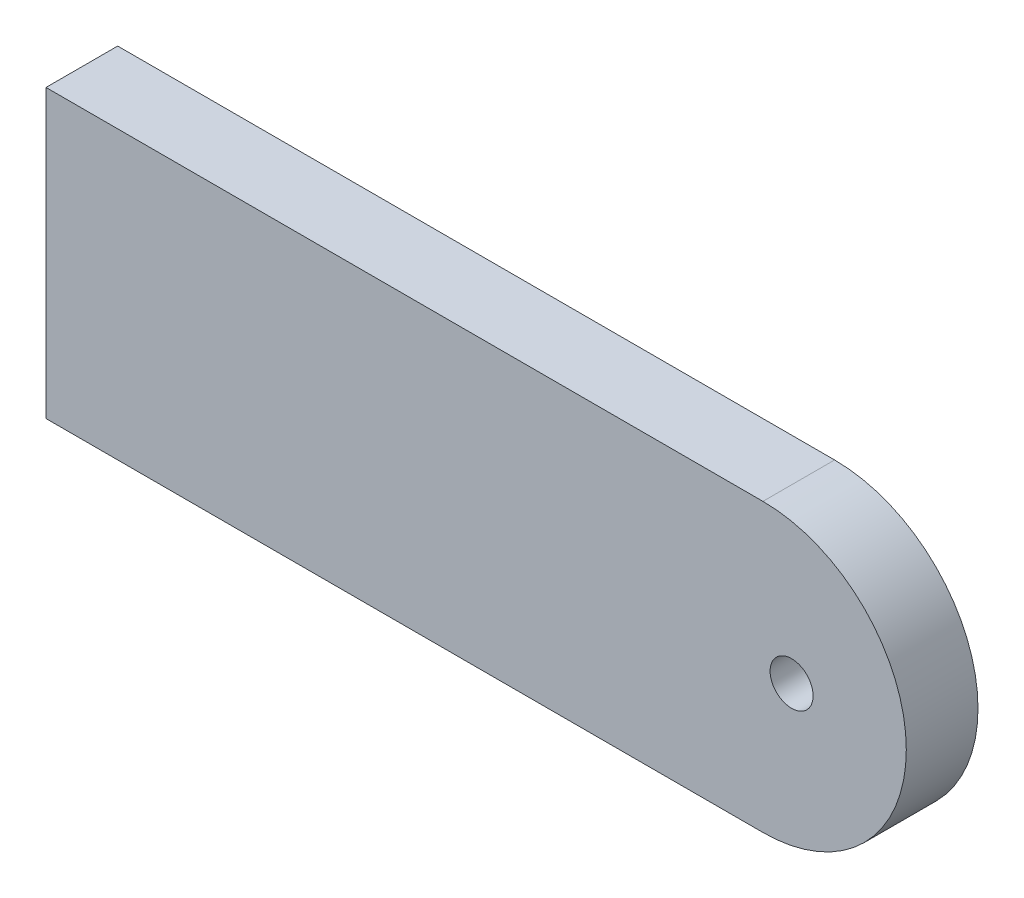
ISO-10303-21;
HEADER;
FILE_DESCRIPTION(('STEP AP214'),'2;1');
FILE_NAME('part.step','',(''),(''),'','','');
FILE_SCHEMA(('AUTOMOTIVE_DESIGN { 1 0 10303 214 1 1 1 1 }'));
ENDSEC;
DATA;
#1=APPLICATION_CONTEXT('core data for automotive mechanical design processes');
#2=APPLICATION_PROTOCOL_DEFINITION('international standard','automotive_design',2000,#1);
#3=PRODUCT_CONTEXT('',#1,'mechanical');
#4=PRODUCT('Part','Part','',(#3));
#5=PRODUCT_RELATED_PRODUCT_CATEGORY('part','',(#4));
#6=PRODUCT_DEFINITION_FORMATION('','',#4);
#7=PRODUCT_DEFINITION_CONTEXT('part definition',#1,'design');
#8=PRODUCT_DEFINITION('design','',#6,#7);
#9=PRODUCT_DEFINITION_SHAPE('','',#8);
#10=(LENGTH_UNIT() NAMED_UNIT(*) SI_UNIT(.MILLI.,.METRE.));
#11=(NAMED_UNIT(*) PLANE_ANGLE_UNIT() SI_UNIT($,.RADIAN.));
#12=(NAMED_UNIT(*) SI_UNIT($,.STERADIAN.) SOLID_ANGLE_UNIT());
#13=UNCERTAINTY_MEASURE_WITH_UNIT(LENGTH_MEASURE(1.E-05),#10,'distance_accuracy_value','');
#14=(GEOMETRIC_REPRESENTATION_CONTEXT(3) GLOBAL_UNCERTAINTY_ASSIGNED_CONTEXT((#13)) GLOBAL_UNIT_ASSIGNED_CONTEXT((#10,
#11,#12)) REPRESENTATION_CONTEXT('',''));
#15=CARTESIAN_POINT('',(0.,0.,0.));
#16=DIRECTION('',(0.,0.,1.));
#17=DIRECTION('',(1.,0.,0.));
#18=AXIS2_PLACEMENT_3D('',#15,#16,#17);
#19=CARTESIAN_POINT('',(0.,0.,5.));
#20=DIRECTION('',(1.,0.,0.));
#21=DIRECTION('',(0.,0.,-1.));
#22=AXIS2_PLACEMENT_3D('',#19,#20,#21);
#23=PLANE('',#22);
#24=DIRECTION('',(0.,-1.,0.));
#25=VECTOR('',#24,1.);
#26=CARTESIAN_POINT('',(0.,0.,0.));
#27=LINE('',#26,#25);
#28=CARTESIAN_POINT('',(0.,20.,0.));
#29=VERTEX_POINT('',#28);
#30=CARTESIAN_POINT('',(0.,0.,0.));
#31=VERTEX_POINT('',#30);
#32=EDGE_CURVE('E96',#29,#31,#27,.T.);
#33=ORIENTED_EDGE('',*,*,#32,.T.);
#34=DIRECTION('',(0.,0.,-1.));
#35=VECTOR('',#34,1.);
#36=CARTESIAN_POINT('',(0.,0.,5.));
#37=LINE('',#36,#35);
#38=CARTESIAN_POINT('',(0.,0.,5.));
#39=VERTEX_POINT('',#38);
#40=EDGE_CURVE('E11',#39,#31,#37,.T.);
#41=ORIENTED_EDGE('',*,*,#40,.F.);
#42=DIRECTION('',(0.,-1.,0.));
#43=VECTOR('',#42,1.);
#44=CARTESIAN_POINT('',(0.,0.,5.));
#45=LINE('',#44,#43);
#46=CARTESIAN_POINT('',(0.,20.,5.));
#47=VERTEX_POINT('',#46);
#48=EDGE_CURVE('E84',#47,#39,#45,.T.);
#49=ORIENTED_EDGE('',*,*,#48,.F.);
#50=DIRECTION('',(0.,0.,-1.));
#51=VECTOR('',#50,1.);
#52=CARTESIAN_POINT('',(0.,20.,5.));
#53=LINE('',#52,#51);
#54=EDGE_CURVE('E92',#47,#29,#53,.T.);
#55=ORIENTED_EDGE('',*,*,#54,.T.);
#56=EDGE_LOOP('',(#33,#41,#49,#55));
#57=FACE_BOUND('',#56,.T.);
#58=ADVANCED_FACE('F33',(#57),#23,.F.);
#59=CARTESIAN_POINT('',(0.,0.,5.));
#60=DIRECTION('',(0.,1.,0.));
#61=DIRECTION('',(-1.,0.,0.));
#62=AXIS2_PLACEMENT_3D('',#59,#60,#61);
#63=PLANE('',#62);
#64=DIRECTION('',(1.,0.,0.));
#65=VECTOR('',#64,1.);
#66=CARTESIAN_POINT('',(0.,0.,0.));
#67=LINE('',#66,#65);
#68=CARTESIAN_POINT('',(50.,0.,0.));
#69=VERTEX_POINT('',#68);
#70=EDGE_CURVE('E88',#31,#69,#67,.T.);
#71=ORIENTED_EDGE('',*,*,#70,.T.);
#72=DIRECTION('',(0.,0.,-1.));
#73=VECTOR('',#72,1.);
#74=CARTESIAN_POINT('',(50.,0.,5.));
#75=LINE('',#74,#73);
#76=CARTESIAN_POINT('',(50.,0.,5.));
#77=VERTEX_POINT('',#76);
#78=EDGE_CURVE('E41',#77,#69,#75,.T.);
#79=ORIENTED_EDGE('',*,*,#78,.F.);
#80=DIRECTION('',(1.,0.,0.));
#81=VECTOR('',#80,1.);
#82=CARTESIAN_POINT('',(0.,0.,5.));
#83=LINE('',#82,#81);
#84=EDGE_CURVE('E79',#39,#77,#83,.T.);
#85=ORIENTED_EDGE('',*,*,#84,.F.);
#86=ORIENTED_EDGE('',*,*,#40,.T.);
#87=EDGE_LOOP('',(#71,#79,#85,#86));
#88=FACE_BOUND('',#87,.T.);
#89=ADVANCED_FACE('F87',(#88),#63,.F.);
#90=CARTESIAN_POINT('',(50.,10.,5.));
#91=DIRECTION('',(0.,0.,-1.));
#92=DIRECTION('',(-1.,0.,0.));
#93=AXIS2_PLACEMENT_3D('',#90,#91,#92);
#94=CYLINDRICAL_SURFACE('',#93,9.99999999999999);
#95=CARTESIAN_POINT('',(50.,10.,0.));
#96=DIRECTION('',(0.,0.,1.));
#97=DIRECTION('',(1.,0.,0.));
#98=AXIS2_PLACEMENT_3D('',#95,#96,#97);
#99=CIRCLE('',#98,9.99999999999999);
#100=CARTESIAN_POINT('',(50.,20.,0.));
#101=VERTEX_POINT('',#100);
#102=EDGE_CURVE('E66',#69,#101,#99,.T.);
#103=ORIENTED_EDGE('',*,*,#102,.T.);
#104=DIRECTION('',(0.,0.,-1.));
#105=VECTOR('',#104,1.);
#106=CARTESIAN_POINT('',(50.,20.,5.));
#107=LINE('',#106,#105);
#108=CARTESIAN_POINT('',(50.,20.,5.));
#109=VERTEX_POINT('',#108);
#110=EDGE_CURVE('E89',#109,#101,#107,.T.);
#111=ORIENTED_EDGE('',*,*,#110,.F.);
#112=CARTESIAN_POINT('',(50.,10.,5.));
#113=DIRECTION('',(0.,0.,1.));
#114=DIRECTION('',(1.,0.,0.));
#115=AXIS2_PLACEMENT_3D('',#112,#113,#114);
#116=CIRCLE('',#115,9.99999999999999);
#117=EDGE_CURVE('E82',#77,#109,#116,.T.);
#118=ORIENTED_EDGE('',*,*,#117,.F.);
#119=ORIENTED_EDGE('',*,*,#78,.T.);
#120=EDGE_LOOP('',(#103,#111,#118,#119));
#121=FACE_BOUND('',#120,.T.);
#122=ADVANCED_FACE('F90',(#121),#94,.T.);
#123=CARTESIAN_POINT('',(0.,20.,5.));
#124=DIRECTION('',(0.,-1.,0.));
#125=DIRECTION('',(0.,0.,-1.));
#126=AXIS2_PLACEMENT_3D('',#123,#124,#125);
#127=PLANE('',#126);
#128=DIRECTION('',(-1.,0.,0.));
#129=VECTOR('',#128,1.);
#130=CARTESIAN_POINT('',(0.,20.,0.));
#131=LINE('',#130,#129);
#132=EDGE_CURVE('E72',#101,#29,#131,.T.);
#133=ORIENTED_EDGE('',*,*,#132,.T.);
#134=ORIENTED_EDGE('',*,*,#54,.F.);
#135=DIRECTION('',(-1.,0.,0.));
#136=VECTOR('',#135,1.);
#137=CARTESIAN_POINT('',(0.,20.,5.));
#138=LINE('',#137,#136);
#139=EDGE_CURVE('E49',#109,#47,#138,.T.);
#140=ORIENTED_EDGE('',*,*,#139,.F.);
#141=ORIENTED_EDGE('',*,*,#110,.T.);
#142=EDGE_LOOP('',(#133,#134,#140,#141));
#143=FACE_BOUND('',#142,.T.);
#144=ADVANCED_FACE('F104',(#143),#127,.F.);
#145=CARTESIAN_POINT('',(50.,10.,5.));
#146=DIRECTION('',(0.,0.,1.));
#147=DIRECTION('',(1.,0.,0.));
#148=AXIS2_PLACEMENT_3D('',#145,#146,#147);
#149=PLANE('',#148);
#150=CARTESIAN_POINT('',(52.,10.,5.));
#151=DIRECTION('',(0.,0.,1.));
#152=DIRECTION('',(1.,0.,0.));
#153=AXIS2_PLACEMENT_3D('',#150,#151,#152);
#154=CIRCLE('',#153,1.5);
#155=CARTESIAN_POINT('',(53.5,10.,5.));
#156=VERTEX_POINT('',#155);
#157=EDGE_CURVE('E110',#156,#156,#154,.T.);
#158=ORIENTED_EDGE('',*,*,#157,.F.);
#159=EDGE_LOOP('',(#158));
#160=FACE_BOUND('',#159,.T.);
#161=ORIENTED_EDGE('',*,*,#48,.T.);
#162=ORIENTED_EDGE('',*,*,#84,.T.);
#163=ORIENTED_EDGE('',*,*,#117,.T.);
#164=ORIENTED_EDGE('',*,*,#139,.T.);
#165=EDGE_LOOP('',(#161,#162,#163,#164));
#166=FACE_BOUND('',#165,.T.);
#167=ADVANCED_FACE('F80',(#160,#166),#149,.T.);
#168=CARTESIAN_POINT('',(50.,10.,0.));
#169=DIRECTION('',(0.,0.,1.));
#170=DIRECTION('',(1.,0.,0.));
#171=AXIS2_PLACEMENT_3D('',#168,#169,#170);
#172=PLANE('',#171);
#173=CARTESIAN_POINT('',(52.,10.,0.));
#174=DIRECTION('',(0.,0.,1.));
#175=DIRECTION('',(1.,0.,0.));
#176=AXIS2_PLACEMENT_3D('',#173,#174,#175);
#177=CIRCLE('',#176,1.5);
#178=CARTESIAN_POINT('',(53.5,10.,0.));
#179=VERTEX_POINT('',#178);
#180=EDGE_CURVE('E99',#179,#179,#177,.T.);
#181=ORIENTED_EDGE('',*,*,#180,.T.);
#182=EDGE_LOOP('',(#181));
#183=FACE_BOUND('',#182,.T.);
#184=ORIENTED_EDGE('',*,*,#32,.F.);
#185=ORIENTED_EDGE('',*,*,#132,.F.);
#186=ORIENTED_EDGE('',*,*,#102,.F.);
#187=ORIENTED_EDGE('',*,*,#70,.F.);
#188=EDGE_LOOP('',(#184,#185,#186,#187));
#189=FACE_BOUND('',#188,.T.);
#190=ADVANCED_FACE('F107',(#183,#189),#172,.F.);
#191=CARTESIAN_POINT('',(52.,10.,0.));
#192=DIRECTION('',(0.,0.,1.));
#193=DIRECTION('',(1.,0.,0.));
#194=AXIS2_PLACEMENT_3D('',#191,#192,#193);
#195=CYLINDRICAL_SURFACE('',#194,1.5);
#196=ORIENTED_EDGE('',*,*,#180,.F.);
#197=EDGE_LOOP('',(#196));
#198=FACE_BOUND('',#197,.T.);
#199=ORIENTED_EDGE('',*,*,#157,.T.);
#200=EDGE_LOOP('',(#199));
#201=FACE_BOUND('',#200,.T.);
#202=ADVANCED_FACE('F117',(#198,#201),#195,.F.);
#203=CLOSED_SHELL('',(#58,#89,#122,#144,#167,#190,#202));
#204=MANIFOLD_SOLID_BREP('B2',#203);
#205=ADVANCED_BREP_SHAPE_REPRESENTATION('',(#18,#204),#14);
#206=SHAPE_DEFINITION_REPRESENTATION(#9,#205);
ENDSEC;
END-ISO-10303-21;
